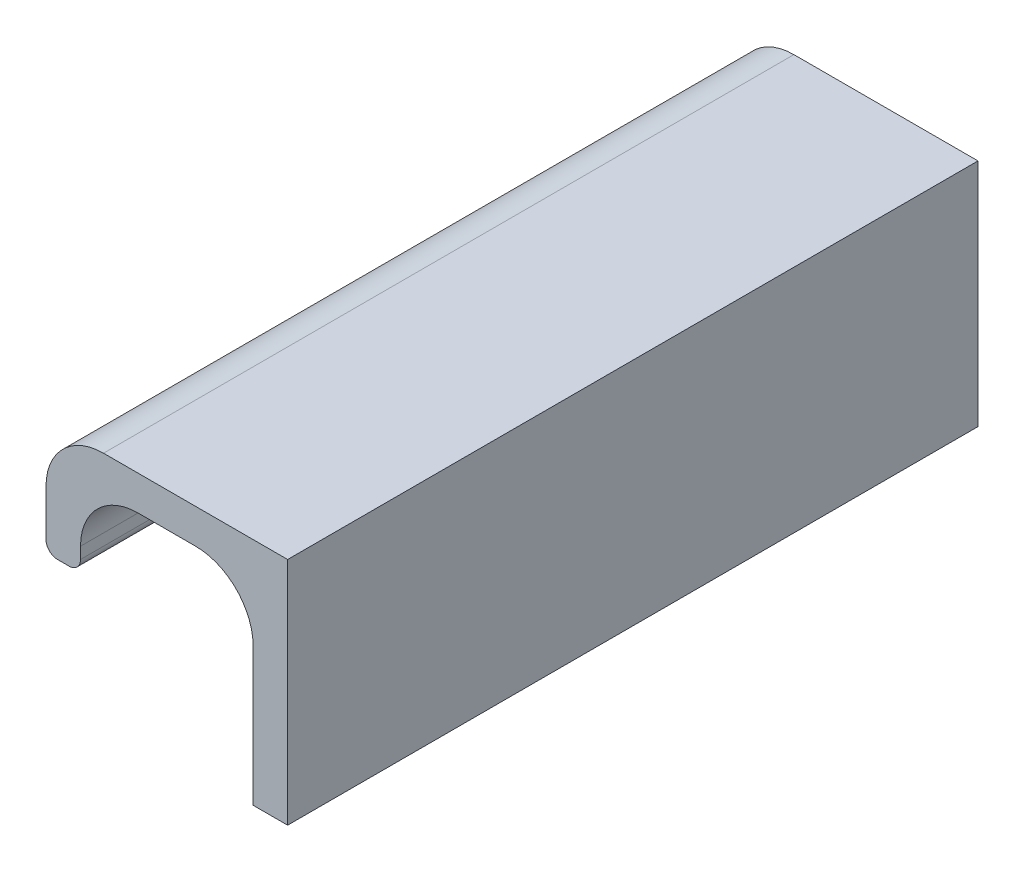
ISO-10303-21;
HEADER;
FILE_DESCRIPTION(('STEP AP214'),'2;1');
FILE_NAME('part.step','',(''),(''),'','','');
FILE_SCHEMA(('AUTOMOTIVE_DESIGN { 1 0 10303 214 1 1 1 1 }'));
ENDSEC;
DATA;
#1=APPLICATION_CONTEXT('core data for automotive mechanical design processes');
#2=APPLICATION_PROTOCOL_DEFINITION('international standard','automotive_design',2000,#1);
#3=PRODUCT_CONTEXT('',#1,'mechanical');
#4=PRODUCT('Part','Part','',(#3));
#5=PRODUCT_RELATED_PRODUCT_CATEGORY('part','',(#4));
#6=PRODUCT_DEFINITION_FORMATION('','',#4);
#7=PRODUCT_DEFINITION_CONTEXT('part definition',#1,'design');
#8=PRODUCT_DEFINITION('design','',#6,#7);
#9=PRODUCT_DEFINITION_SHAPE('','',#8);
#10=(LENGTH_UNIT() NAMED_UNIT(*) SI_UNIT(.MILLI.,.METRE.));
#11=(NAMED_UNIT(*) PLANE_ANGLE_UNIT() SI_UNIT($,.RADIAN.));
#12=(NAMED_UNIT(*) SI_UNIT($,.STERADIAN.) SOLID_ANGLE_UNIT());
#13=UNCERTAINTY_MEASURE_WITH_UNIT(LENGTH_MEASURE(1.E-05),#10,'distance_accuracy_value','');
#14=(GEOMETRIC_REPRESENTATION_CONTEXT(3) GLOBAL_UNCERTAINTY_ASSIGNED_CONTEXT((#13)) GLOBAL_UNIT_ASSIGNED_CONTEXT((#10,
#11,#12)) REPRESENTATION_CONTEXT('',''));
#15=CARTESIAN_POINT('',(0.,0.,0.));
#16=DIRECTION('',(0.,0.,1.));
#17=DIRECTION('',(1.,0.,0.));
#18=AXIS2_PLACEMENT_3D('',#15,#16,#17);
#19=CARTESIAN_POINT('',(-16.,0.,60.));
#20=DIRECTION('',(0.,-1.,0.));
#21=DIRECTION('',(0.,0.,-1.));
#22=AXIS2_PLACEMENT_3D('',#19,#20,#21);
#23=PLANE('',#22);
#24=DIRECTION('',(-1.,0.,0.));
#25=VECTOR('',#24,1.);
#26=CARTESIAN_POINT('',(-16.,0.,0.));
#27=LINE('',#26,#25);
#28=CARTESIAN_POINT('',(0.,0.,0.));
#29=VERTEX_POINT('',#28);
#30=CARTESIAN_POINT('',(-16.,0.,0.));
#31=VERTEX_POINT('',#30);
#32=EDGE_CURVE('E159',#29,#31,#27,.T.);
#33=ORIENTED_EDGE('',*,*,#32,.T.);
#34=DIRECTION('',(0.,0.,-1.));
#35=VECTOR('',#34,1.);
#36=CARTESIAN_POINT('',(-16.,0.,60.));
#37=LINE('',#36,#35);
#38=CARTESIAN_POINT('',(-16.,0.,60.));
#39=VERTEX_POINT('',#38);
#40=EDGE_CURVE('E11',#39,#31,#37,.T.);
#41=ORIENTED_EDGE('',*,*,#40,.F.);
#42=DIRECTION('',(-1.,0.,0.));
#43=VECTOR('',#42,1.);
#44=CARTESIAN_POINT('',(-16.,0.,60.));
#45=LINE('',#44,#43);
#46=CARTESIAN_POINT('',(0.,0.,60.));
#47=VERTEX_POINT('',#46);
#48=EDGE_CURVE('E183',#47,#39,#45,.T.);
#49=ORIENTED_EDGE('',*,*,#48,.F.);
#50=DIRECTION('',(0.,0.,-1.));
#51=VECTOR('',#50,1.);
#52=CARTESIAN_POINT('',(0.,0.,60.));
#53=LINE('',#52,#51);
#54=EDGE_CURVE('E155',#47,#29,#53,.T.);
#55=ORIENTED_EDGE('',*,*,#54,.T.);
#56=EDGE_LOOP('',(#33,#41,#49,#55));
#57=FACE_BOUND('',#56,.T.);
#58=ADVANCED_FACE('F33',(#57),#23,.F.);
#59=CARTESIAN_POINT('',(-16.,-5.,60.));
#60=DIRECTION('',(0.,0.,-1.));
#61=DIRECTION('',(-1.,0.,0.));
#62=AXIS2_PLACEMENT_3D('',#59,#60,#61);
#63=CYLINDRICAL_SURFACE('',#62,5.);
#64=CARTESIAN_POINT('',(-16.,-5.,0.));
#65=DIRECTION('',(0.,0.,1.));
#66=DIRECTION('',(-1.,0.,0.));
#67=AXIS2_PLACEMENT_3D('',#64,#65,#66);
#68=CIRCLE('',#67,5.);
#69=CARTESIAN_POINT('',(-21.,-5.00000000000004,0.));
#70=VERTEX_POINT('',#69);
#71=EDGE_CURVE('E162',#31,#70,#68,.T.);
#72=ORIENTED_EDGE('',*,*,#71,.T.);
#73=DIRECTION('',(0.,0.,-1.));
#74=VECTOR('',#73,1.);
#75=CARTESIAN_POINT('',(-21.,-5.00000000000004,60.));
#76=LINE('',#75,#74);
#77=CARTESIAN_POINT('',(-21.,-5.00000000000004,60.));
#78=VERTEX_POINT('',#77);
#79=EDGE_CURVE('E41',#78,#70,#76,.T.);
#80=ORIENTED_EDGE('',*,*,#79,.F.);
#81=CARTESIAN_POINT('',(-16.,-5.,60.));
#82=DIRECTION('',(0.,0.,1.));
#83=DIRECTION('',(-1.,0.,0.));
#84=AXIS2_PLACEMENT_3D('',#81,#82,#83);
#85=CIRCLE('',#84,5.);
#86=EDGE_CURVE('E107',#39,#78,#85,.T.);
#87=ORIENTED_EDGE('',*,*,#86,.F.);
#88=ORIENTED_EDGE('',*,*,#40,.T.);
#89=EDGE_LOOP('',(#72,#80,#87,#88));
#90=FACE_BOUND('',#89,.T.);
#91=ADVANCED_FACE('F266',(#90),#63,.T.);
#92=CARTESIAN_POINT('',(-21.,-8.99999999999999,60.));
#93=DIRECTION('',(1.,0.,0.));
#94=DIRECTION('',(0.,0.,-1.));
#95=AXIS2_PLACEMENT_3D('',#92,#93,#94);
#96=PLANE('',#95);
#97=DIRECTION('',(0.,-1.,0.));
#98=VECTOR('',#97,1.);
#99=CARTESIAN_POINT('',(-21.,-8.99999999999999,0.));
#100=LINE('',#99,#98);
#101=CARTESIAN_POINT('',(-21.,-9.,0.));
#102=VERTEX_POINT('',#101);
#103=EDGE_CURVE('E164',#70,#102,#100,.T.);
#104=ORIENTED_EDGE('',*,*,#103,.T.);
#105=DIRECTION('',(0.,0.,-1.));
#106=VECTOR('',#105,1.);
#107=CARTESIAN_POINT('',(-21.,-9.,60.));
#108=LINE('',#107,#106);
#109=CARTESIAN_POINT('',(-21.,-9.,60.));
#110=VERTEX_POINT('',#109);
#111=EDGE_CURVE('E205',#110,#102,#108,.T.);
#112=ORIENTED_EDGE('',*,*,#111,.F.);
#113=DIRECTION('',(0.,-1.,0.));
#114=VECTOR('',#113,1.);
#115=CARTESIAN_POINT('',(-21.,-8.99999999999999,60.));
#116=LINE('',#115,#114);
#117=EDGE_CURVE('E213',#78,#110,#116,.T.);
#118=ORIENTED_EDGE('',*,*,#117,.F.);
#119=ORIENTED_EDGE('',*,*,#79,.T.);
#120=EDGE_LOOP('',(#104,#112,#118,#119));
#121=FACE_BOUND('',#120,.T.);
#122=ADVANCED_FACE('F211',(#121),#96,.F.);
#123=CARTESIAN_POINT('',(-20.,-9.,60.));
#124=DIRECTION('',(0.,0.,-1.));
#125=DIRECTION('',(-1.,0.,0.));
#126=AXIS2_PLACEMENT_3D('',#123,#124,#125);
#127=CYLINDRICAL_SURFACE('',#126,1.);
#128=CARTESIAN_POINT('',(-20.,-9.,0.));
#129=DIRECTION('',(0.,0.,1.));
#130=DIRECTION('',(-1.,0.,0.));
#131=AXIS2_PLACEMENT_3D('',#128,#129,#130);
#132=CIRCLE('',#131,1.);
#133=CARTESIAN_POINT('',(-20.,-10.,0.));
#134=VERTEX_POINT('',#133);
#135=EDGE_CURVE('E166',#102,#134,#132,.T.);
#136=ORIENTED_EDGE('',*,*,#135,.T.);
#137=DIRECTION('',(0.,0.,-1.));
#138=VECTOR('',#137,1.);
#139=CARTESIAN_POINT('',(-20.,-10.,60.));
#140=LINE('',#139,#138);
#141=CARTESIAN_POINT('',(-20.,-10.,60.));
#142=VERTEX_POINT('',#141);
#143=EDGE_CURVE('E202',#142,#134,#140,.T.);
#144=ORIENTED_EDGE('',*,*,#143,.F.);
#145=CARTESIAN_POINT('',(-20.,-9.,60.));
#146=DIRECTION('',(0.,0.,1.));
#147=DIRECTION('',(-1.,0.,0.));
#148=AXIS2_PLACEMENT_3D('',#145,#146,#147);
#149=CIRCLE('',#148,1.);
#150=EDGE_CURVE('E231',#110,#142,#149,.T.);
#151=ORIENTED_EDGE('',*,*,#150,.F.);
#152=ORIENTED_EDGE('',*,*,#111,.T.);
#153=EDGE_LOOP('',(#136,#144,#151,#152));
#154=FACE_BOUND('',#153,.T.);
#155=ADVANCED_FACE('F222',(#154),#127,.T.);
#156=CARTESIAN_POINT('',(-19.,-10.,60.));
#157=DIRECTION('',(0.,1.,0.));
#158=DIRECTION('',(0.,0.,1.));
#159=AXIS2_PLACEMENT_3D('',#156,#157,#158);
#160=PLANE('',#159);
#161=DIRECTION('',(1.,0.,0.));
#162=VECTOR('',#161,1.);
#163=CARTESIAN_POINT('',(-19.,-10.,0.));
#164=LINE('',#163,#162);
#165=CARTESIAN_POINT('',(-19.,-10.,0.));
#166=VERTEX_POINT('',#165);
#167=EDGE_CURVE('E168',#134,#166,#164,.T.);
#168=ORIENTED_EDGE('',*,*,#167,.T.);
#169=DIRECTION('',(0.,0.,-1.));
#170=VECTOR('',#169,1.);
#171=CARTESIAN_POINT('',(-19.,-10.,60.));
#172=LINE('',#171,#170);
#173=CARTESIAN_POINT('',(-19.,-10.,60.));
#174=VERTEX_POINT('',#173);
#175=EDGE_CURVE('E199',#174,#166,#172,.T.);
#176=ORIENTED_EDGE('',*,*,#175,.F.);
#177=DIRECTION('',(1.,0.,0.));
#178=VECTOR('',#177,1.);
#179=CARTESIAN_POINT('',(-19.,-10.,60.));
#180=LINE('',#179,#178);
#181=EDGE_CURVE('E228',#142,#174,#180,.T.);
#182=ORIENTED_EDGE('',*,*,#181,.F.);
#183=ORIENTED_EDGE('',*,*,#143,.T.);
#184=EDGE_LOOP('',(#168,#176,#182,#183));
#185=FACE_BOUND('',#184,.T.);
#186=ADVANCED_FACE('F226',(#185),#160,.F.);
#187=CARTESIAN_POINT('',(-19.,-9.,60.));
#188=DIRECTION('',(0.,0.,-1.));
#189=DIRECTION('',(-1.,0.,0.));
#190=AXIS2_PLACEMENT_3D('',#187,#188,#189);
#191=CYLINDRICAL_SURFACE('',#190,1.);
#192=CARTESIAN_POINT('',(-19.,-9.,0.));
#193=DIRECTION('',(0.,0.,1.));
#194=DIRECTION('',(-1.,0.,0.));
#195=AXIS2_PLACEMENT_3D('',#192,#193,#194);
#196=CIRCLE('',#195,1.);
#197=CARTESIAN_POINT('',(-18.,-8.99999999999999,0.));
#198=VERTEX_POINT('',#197);
#199=EDGE_CURVE('E170',#166,#198,#196,.T.);
#200=ORIENTED_EDGE('',*,*,#199,.T.);
#201=DIRECTION('',(0.,0.,-1.));
#202=VECTOR('',#201,1.);
#203=CARTESIAN_POINT('',(-18.,-8.99999999999999,60.));
#204=LINE('',#203,#202);
#205=CARTESIAN_POINT('',(-18.,-8.99999999999999,60.));
#206=VERTEX_POINT('',#205);
#207=EDGE_CURVE('E196',#206,#198,#204,.T.);
#208=ORIENTED_EDGE('',*,*,#207,.F.);
#209=CARTESIAN_POINT('',(-19.,-9.,60.));
#210=DIRECTION('',(0.,0.,1.));
#211=DIRECTION('',(-1.,0.,0.));
#212=AXIS2_PLACEMENT_3D('',#209,#210,#211);
#213=CIRCLE('',#212,1.);
#214=EDGE_CURVE('E230',#174,#206,#213,.T.);
#215=ORIENTED_EDGE('',*,*,#214,.F.);
#216=ORIENTED_EDGE('',*,*,#175,.T.);
#217=EDGE_LOOP('',(#200,#208,#215,#216));
#218=FACE_BOUND('',#217,.T.);
#219=ADVANCED_FACE('F279',(#218),#191,.T.);
#220=CARTESIAN_POINT('',(-18.,-8.00000000000004,60.));
#221=DIRECTION('',(-1.,0.,0.));
#222=DIRECTION('',(0.,0.,1.));
#223=AXIS2_PLACEMENT_3D('',#220,#221,#222);
#224=PLANE('',#223);
#225=DIRECTION('',(0.,1.,0.));
#226=VECTOR('',#225,1.);
#227=CARTESIAN_POINT('',(-18.,-8.00000000000004,0.));
#228=LINE('',#227,#226);
#229=CARTESIAN_POINT('',(-18.,-8.00000000000004,0.));
#230=VERTEX_POINT('',#229);
#231=EDGE_CURVE('E172',#198,#230,#228,.T.);
#232=ORIENTED_EDGE('',*,*,#231,.T.);
#233=DIRECTION('',(0.,0.,-1.));
#234=VECTOR('',#233,1.);
#235=CARTESIAN_POINT('',(-18.,-8.00000000000004,60.));
#236=LINE('',#235,#234);
#237=CARTESIAN_POINT('',(-18.,-8.00000000000004,60.));
#238=VERTEX_POINT('',#237);
#239=EDGE_CURVE('E193',#238,#230,#236,.T.);
#240=ORIENTED_EDGE('',*,*,#239,.F.);
#241=DIRECTION('',(0.,1.,0.));
#242=VECTOR('',#241,1.);
#243=CARTESIAN_POINT('',(-18.,-8.00000000000004,60.));
#244=LINE('',#243,#242);
#245=EDGE_CURVE('E233',#206,#238,#244,.T.);
#246=ORIENTED_EDGE('',*,*,#245,.F.);
#247=ORIENTED_EDGE('',*,*,#207,.T.);
#248=EDGE_LOOP('',(#232,#240,#246,#247));
#249=FACE_BOUND('',#248,.T.);
#250=ADVANCED_FACE('F282',(#249),#224,.F.);
#251=CARTESIAN_POINT('',(-13.,-8.,60.));
#252=DIRECTION('',(0.,0.,-1.));
#253=DIRECTION('',(-1.,0.,0.));
#254=AXIS2_PLACEMENT_3D('',#251,#252,#253);
#255=CYLINDRICAL_SURFACE('',#254,5.);
#256=CARTESIAN_POINT('',(-13.,-8.,0.));
#257=DIRECTION('',(0.,0.,-1.));
#258=DIRECTION('',(1.,0.,0.));
#259=AXIS2_PLACEMENT_3D('',#256,#257,#258);
#260=CIRCLE('',#259,5.);
#261=CARTESIAN_POINT('',(-13.,-3.,0.));
#262=VERTEX_POINT('',#261);
#263=EDGE_CURVE('E174',#230,#262,#260,.T.);
#264=ORIENTED_EDGE('',*,*,#263,.T.);
#265=DIRECTION('',(0.,0.,-1.));
#266=VECTOR('',#265,1.);
#267=CARTESIAN_POINT('',(-13.,-3.,60.));
#268=LINE('',#267,#266);
#269=CARTESIAN_POINT('',(-13.,-3.,60.));
#270=VERTEX_POINT('',#269);
#271=EDGE_CURVE('E190',#270,#262,#268,.T.);
#272=ORIENTED_EDGE('',*,*,#271,.F.);
#273=CARTESIAN_POINT('',(-13.,-8.,60.));
#274=DIRECTION('',(0.,0.,-1.));
#275=DIRECTION('',(1.,0.,0.));
#276=AXIS2_PLACEMENT_3D('',#273,#274,#275);
#277=CIRCLE('',#276,5.);
#278=EDGE_CURVE('E239',#238,#270,#277,.T.);
#279=ORIENTED_EDGE('',*,*,#278,.F.);
#280=ORIENTED_EDGE('',*,*,#239,.T.);
#281=EDGE_LOOP('',(#264,#272,#279,#280));
#282=FACE_BOUND('',#281,.T.);
#283=ADVANCED_FACE('F286',(#282),#255,.F.);
#284=CARTESIAN_POINT('',(-8.00000000000003,-3.,60.));
#285=DIRECTION('',(0.,1.,0.));
#286=DIRECTION('',(-1.,0.,0.));
#287=AXIS2_PLACEMENT_3D('',#284,#285,#286);
#288=PLANE('',#287);
#289=DIRECTION('',(1.,0.,0.));
#290=VECTOR('',#289,1.);
#291=CARTESIAN_POINT('',(-8.00000000000003,-3.,0.));
#292=LINE('',#291,#290);
#293=CARTESIAN_POINT('',(-8.00000000000003,-3.,0.));
#294=VERTEX_POINT('',#293);
#295=EDGE_CURVE('E176',#262,#294,#292,.T.);
#296=ORIENTED_EDGE('',*,*,#295,.T.);
#297=DIRECTION('',(0.,0.,-1.));
#298=VECTOR('',#297,1.);
#299=CARTESIAN_POINT('',(-8.00000000000003,-3.,60.));
#300=LINE('',#299,#298);
#301=CARTESIAN_POINT('',(-8.00000000000003,-3.,60.));
#302=VERTEX_POINT('',#301);
#303=EDGE_CURVE('E187',#302,#294,#300,.T.);
#304=ORIENTED_EDGE('',*,*,#303,.F.);
#305=DIRECTION('',(1.,0.,0.));
#306=VECTOR('',#305,1.);
#307=CARTESIAN_POINT('',(-8.00000000000003,-3.,60.));
#308=LINE('',#307,#306);
#309=EDGE_CURVE('E241',#270,#302,#308,.T.);
#310=ORIENTED_EDGE('',*,*,#309,.F.);
#311=ORIENTED_EDGE('',*,*,#271,.T.);
#312=EDGE_LOOP('',(#296,#304,#310,#311));
#313=FACE_BOUND('',#312,.T.);
#314=ADVANCED_FACE('F247',(#313),#288,.F.);
#315=CARTESIAN_POINT('',(-8.,-8.,60.));
#316=DIRECTION('',(0.,0.,-1.));
#317=DIRECTION('',(-1.,0.,0.));
#318=AXIS2_PLACEMENT_3D('',#315,#316,#317);
#319=CYLINDRICAL_SURFACE('',#318,5.);
#320=CARTESIAN_POINT('',(-8.,-8.,0.));
#321=DIRECTION('',(0.,0.,-1.));
#322=DIRECTION('',(1.,0.,0.));
#323=AXIS2_PLACEMENT_3D('',#320,#321,#322);
#324=CIRCLE('',#323,5.);
#325=CARTESIAN_POINT('',(-3.,-8.00000000000004,0.));
#326=VERTEX_POINT('',#325);
#327=EDGE_CURVE('E178',#294,#326,#324,.T.);
#328=ORIENTED_EDGE('',*,*,#327,.T.);
#329=DIRECTION('',(0.,0.,-1.));
#330=VECTOR('',#329,1.);
#331=CARTESIAN_POINT('',(-3.,-8.00000000000004,60.));
#332=LINE('',#331,#330);
#333=CARTESIAN_POINT('',(-3.,-8.00000000000004,60.));
#334=VERTEX_POINT('',#333);
#335=EDGE_CURVE('E150',#334,#326,#332,.T.);
#336=ORIENTED_EDGE('',*,*,#335,.F.);
#337=CARTESIAN_POINT('',(-8.,-8.,60.));
#338=DIRECTION('',(0.,0.,-1.));
#339=DIRECTION('',(1.,0.,0.));
#340=AXIS2_PLACEMENT_3D('',#337,#338,#339);
#341=CIRCLE('',#340,5.);
#342=EDGE_CURVE('E141',#302,#334,#341,.T.);
#343=ORIENTED_EDGE('',*,*,#342,.F.);
#344=ORIENTED_EDGE('',*,*,#303,.T.);
#345=EDGE_LOOP('',(#328,#336,#343,#344));
#346=FACE_BOUND('',#345,.T.);
#347=ADVANCED_FACE('F251',(#346),#319,.F.);
#348=CARTESIAN_POINT('',(-3.,-20.,60.));
#349=DIRECTION('',(1.,0.,0.));
#350=DIRECTION('',(0.,0.,-1.));
#351=AXIS2_PLACEMENT_3D('',#348,#349,#350);
#352=PLANE('',#351);
#353=DIRECTION('',(0.,-1.,0.));
#354=VECTOR('',#353,1.);
#355=CARTESIAN_POINT('',(-3.,-20.,0.));
#356=LINE('',#355,#354);
#357=CARTESIAN_POINT('',(-3.,-20.,0.));
#358=VERTEX_POINT('',#357);
#359=EDGE_CURVE('E149',#326,#358,#356,.T.);
#360=ORIENTED_EDGE('',*,*,#359,.T.);
#361=DIRECTION('',(0.,0.,-1.));
#362=VECTOR('',#361,1.);
#363=CARTESIAN_POINT('',(-3.,-20.,60.));
#364=LINE('',#363,#362);
#365=CARTESIAN_POINT('',(-3.,-20.,60.));
#366=VERTEX_POINT('',#365);
#367=EDGE_CURVE('E146',#366,#358,#364,.T.);
#368=ORIENTED_EDGE('',*,*,#367,.F.);
#369=DIRECTION('',(0.,-1.,0.));
#370=VECTOR('',#369,1.);
#371=CARTESIAN_POINT('',(-3.,-20.,60.));
#372=LINE('',#371,#370);
#373=EDGE_CURVE('E135',#334,#366,#372,.T.);
#374=ORIENTED_EDGE('',*,*,#373,.F.);
#375=ORIENTED_EDGE('',*,*,#335,.T.);
#376=EDGE_LOOP('',(#360,#368,#374,#375));
#377=FACE_BOUND('',#376,.T.);
#378=ADVANCED_FACE('F147',(#377),#352,.F.);
#379=CARTESIAN_POINT('',(0.,-20.,60.));
#380=DIRECTION('',(0.,1.,0.));
#381=DIRECTION('',(0.,0.,1.));
#382=AXIS2_PLACEMENT_3D('',#379,#380,#381);
#383=PLANE('',#382);
#384=DIRECTION('',(1.,0.,0.));
#385=VECTOR('',#384,1.);
#386=CARTESIAN_POINT('',(0.,-20.,0.));
#387=LINE('',#386,#385);
#388=CARTESIAN_POINT('',(0.,-20.,0.));
#389=VERTEX_POINT('',#388);
#390=EDGE_CURVE('E93',#358,#389,#387,.T.);
#391=ORIENTED_EDGE('',*,*,#390,.T.);
#392=DIRECTION('',(0.,0.,-1.));
#393=VECTOR('',#392,1.);
#394=CARTESIAN_POINT('',(0.,-20.,60.));
#395=LINE('',#394,#393);
#396=CARTESIAN_POINT('',(0.,-20.,60.));
#397=VERTEX_POINT('',#396);
#398=EDGE_CURVE('E151',#397,#389,#395,.T.);
#399=ORIENTED_EDGE('',*,*,#398,.F.);
#400=DIRECTION('',(1.,0.,0.));
#401=VECTOR('',#400,1.);
#402=CARTESIAN_POINT('',(0.,-20.,60.));
#403=LINE('',#402,#401);
#404=EDGE_CURVE('E139',#366,#397,#403,.T.);
#405=ORIENTED_EDGE('',*,*,#404,.F.);
#406=ORIENTED_EDGE('',*,*,#367,.T.);
#407=EDGE_LOOP('',(#391,#399,#405,#406));
#408=FACE_BOUND('',#407,.T.);
#409=ADVANCED_FACE('F153',(#408),#383,.F.);
#410=CARTESIAN_POINT('',(0.,0.,60.));
#411=DIRECTION('',(-1.,0.,0.));
#412=DIRECTION('',(0.,0.,1.));
#413=AXIS2_PLACEMENT_3D('',#410,#411,#412);
#414=PLANE('',#413);
#415=DIRECTION('',(0.,1.,0.));
#416=VECTOR('',#415,1.);
#417=CARTESIAN_POINT('',(0.,0.,0.));
#418=LINE('',#417,#416);
#419=EDGE_CURVE('E99',#389,#29,#418,.T.);
#420=ORIENTED_EDGE('',*,*,#419,.T.);
#421=ORIENTED_EDGE('',*,*,#54,.F.);
#422=DIRECTION('',(0.,1.,0.));
#423=VECTOR('',#422,1.);
#424=CARTESIAN_POINT('',(0.,0.,60.));
#425=LINE('',#424,#423);
#426=EDGE_CURVE('E49',#397,#47,#425,.T.);
#427=ORIENTED_EDGE('',*,*,#426,.F.);
#428=ORIENTED_EDGE('',*,*,#398,.T.);
#429=EDGE_LOOP('',(#420,#421,#427,#428));
#430=FACE_BOUND('',#429,.T.);
#431=ADVANCED_FACE('F255',(#430),#414,.F.);
#432=CARTESIAN_POINT('',(-8.,-8.,60.));
#433=DIRECTION('',(0.,0.,1.));
#434=DIRECTION('',(1.,0.,0.));
#435=AXIS2_PLACEMENT_3D('',#432,#433,#434);
#436=PLANE('',#435);
#437=ORIENTED_EDGE('',*,*,#48,.T.);
#438=ORIENTED_EDGE('',*,*,#86,.T.);
#439=ORIENTED_EDGE('',*,*,#117,.T.);
#440=ORIENTED_EDGE('',*,*,#150,.T.);
#441=ORIENTED_EDGE('',*,*,#181,.T.);
#442=ORIENTED_EDGE('',*,*,#214,.T.);
#443=ORIENTED_EDGE('',*,*,#245,.T.);
#444=ORIENTED_EDGE('',*,*,#278,.T.);
#445=ORIENTED_EDGE('',*,*,#309,.T.);
#446=ORIENTED_EDGE('',*,*,#342,.T.);
#447=ORIENTED_EDGE('',*,*,#373,.T.);
#448=ORIENTED_EDGE('',*,*,#404,.T.);
#449=ORIENTED_EDGE('',*,*,#426,.T.);
#450=EDGE_LOOP('',(#437,#438,#439,#440,#441,#442,#443,#444,#445,#446,#447,#448,#449));
#451=FACE_BOUND('',#450,.T.);
#452=ADVANCED_FACE('F137',(#451),#436,.T.);
#453=CARTESIAN_POINT('',(-8.,-8.,0.));
#454=DIRECTION('',(0.,0.,1.));
#455=DIRECTION('',(1.,0.,0.));
#456=AXIS2_PLACEMENT_3D('',#453,#454,#455);
#457=PLANE('',#456);
#458=ORIENTED_EDGE('',*,*,#32,.F.);
#459=ORIENTED_EDGE('',*,*,#419,.F.);
#460=ORIENTED_EDGE('',*,*,#390,.F.);
#461=ORIENTED_EDGE('',*,*,#359,.F.);
#462=ORIENTED_EDGE('',*,*,#327,.F.);
#463=ORIENTED_EDGE('',*,*,#295,.F.);
#464=ORIENTED_EDGE('',*,*,#263,.F.);
#465=ORIENTED_EDGE('',*,*,#231,.F.);
#466=ORIENTED_EDGE('',*,*,#199,.F.);
#467=ORIENTED_EDGE('',*,*,#167,.F.);
#468=ORIENTED_EDGE('',*,*,#135,.F.);
#469=ORIENTED_EDGE('',*,*,#103,.F.);
#470=ORIENTED_EDGE('',*,*,#71,.F.);
#471=EDGE_LOOP('',(#458,#459,#460,#461,#462,#463,#464,#465,#466,#467,#468,#469,#470));
#472=FACE_BOUND('',#471,.T.);
#473=ADVANCED_FACE('F217',(#472),#457,.F.);
#474=CLOSED_SHELL('',(#58,#91,#122,#155,#186,#219,#250,#283,#314,#347,#378,#409,#431,#452,#473));
#475=MANIFOLD_SOLID_BREP('B2',#474);
#476=ADVANCED_BREP_SHAPE_REPRESENTATION('',(#18,#475),#14);
#477=SHAPE_DEFINITION_REPRESENTATION(#9,#476);
ENDSEC;
END-ISO-10303-21;
